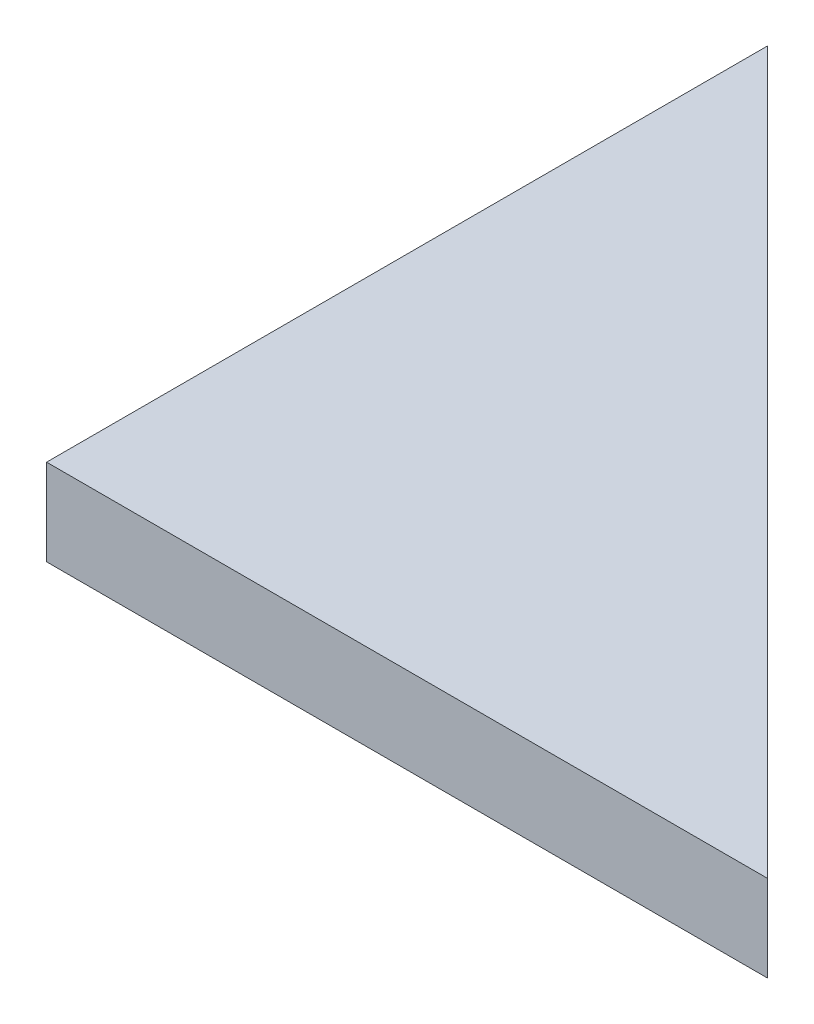
ISO-10303-21;
HEADER;
FILE_DESCRIPTION(('STEP AP214'),'2;1');
FILE_NAME('part.step','',(''),(''),'','','');
FILE_SCHEMA(('AUTOMOTIVE_DESIGN { 1 0 10303 214 1 1 1 1 }'));
ENDSEC;
DATA;
#1=APPLICATION_CONTEXT('core data for automotive mechanical design processes');
#2=APPLICATION_PROTOCOL_DEFINITION('international standard','automotive_design',2000,#1);
#3=PRODUCT_CONTEXT('',#1,'mechanical');
#4=PRODUCT('Part','Part','',(#3));
#5=PRODUCT_RELATED_PRODUCT_CATEGORY('part','',(#4));
#6=PRODUCT_DEFINITION_FORMATION('','',#4);
#7=PRODUCT_DEFINITION_CONTEXT('part definition',#1,'design');
#8=PRODUCT_DEFINITION('design','',#6,#7);
#9=PRODUCT_DEFINITION_SHAPE('','',#8);
#10=(LENGTH_UNIT() NAMED_UNIT(*) SI_UNIT(.MILLI.,.METRE.));
#11=(NAMED_UNIT(*) PLANE_ANGLE_UNIT() SI_UNIT($,.RADIAN.));
#12=(NAMED_UNIT(*) SI_UNIT($,.STERADIAN.) SOLID_ANGLE_UNIT());
#13=UNCERTAINTY_MEASURE_WITH_UNIT(LENGTH_MEASURE(1.E-05),#10,'distance_accuracy_value','');
#14=(GEOMETRIC_REPRESENTATION_CONTEXT(3) GLOBAL_UNCERTAINTY_ASSIGNED_CONTEXT((#13)) GLOBAL_UNIT_ASSIGNED_CONTEXT((#10,
#11,#12)) REPRESENTATION_CONTEXT('',''));
#15=CARTESIAN_POINT('',(0.,0.,0.));
#16=DIRECTION('',(0.,0.,1.));
#17=DIRECTION('',(1.,0.,0.));
#18=AXIS2_PLACEMENT_3D('',#15,#16,#17);
#19=CARTESIAN_POINT('',(0.,18.25625,0.));
#20=DIRECTION('',(0.,0.,-1.));
#21=DIRECTION('',(-1.,0.,0.));
#22=AXIS2_PLACEMENT_3D('',#19,#20,#21);
#23=PLANE('',#22);
#24=DIRECTION('',(1.,0.,0.));
#25=VECTOR('',#24,1.);
#26=CARTESIAN_POINT('',(0.,0.,0.));
#27=LINE('',#26,#25);
#28=CARTESIAN_POINT('',(0.,0.,0.));
#29=VERTEX_POINT('',#28);
#30=CARTESIAN_POINT('',(152.4,0.,0.));
#31=VERTEX_POINT('',#30);
#32=EDGE_CURVE('E81',#29,#31,#27,.T.);
#33=ORIENTED_EDGE('',*,*,#32,.T.);
#34=DIRECTION('',(0.,-1.,0.));
#35=VECTOR('',#34,1.);
#36=CARTESIAN_POINT('',(152.4,18.25625,0.));
#37=LINE('',#36,#35);
#38=CARTESIAN_POINT('',(152.4,18.25625,0.));
#39=VERTEX_POINT('',#38);
#40=EDGE_CURVE('E11',#39,#31,#37,.T.);
#41=ORIENTED_EDGE('',*,*,#40,.F.);
#42=DIRECTION('',(1.,0.,0.));
#43=VECTOR('',#42,1.);
#44=CARTESIAN_POINT('',(0.,18.25625,0.));
#45=LINE('',#44,#43);
#46=CARTESIAN_POINT('',(0.,18.25625,0.));
#47=VERTEX_POINT('',#46);
#48=EDGE_CURVE('E74',#47,#39,#45,.T.);
#49=ORIENTED_EDGE('',*,*,#48,.F.);
#50=DIRECTION('',(0.,-1.,0.));
#51=VECTOR('',#50,1.);
#52=CARTESIAN_POINT('',(0.,18.25625,0.));
#53=LINE('',#52,#51);
#54=EDGE_CURVE('E82',#47,#29,#53,.T.);
#55=ORIENTED_EDGE('',*,*,#54,.T.);
#56=EDGE_LOOP('',(#33,#41,#49,#55));
#57=FACE_BOUND('',#56,.T.);
#58=ADVANCED_FACE('F34',(#57),#23,.F.);
#59=CARTESIAN_POINT('',(0.,18.25625,-152.4));
#60=DIRECTION('',(-0.707106781186548,0.,0.707106781186548));
#61=DIRECTION('',(0.707106781186548,0.,0.707106781186548));
#62=AXIS2_PLACEMENT_3D('',#59,#60,#61);
#63=PLANE('',#62);
#64=DIRECTION('',(-0.707106781186547,0.,-0.707106781186547));
#65=VECTOR('',#64,1.);
#66=CARTESIAN_POINT('',(0.,0.,-152.4));
#67=LINE('',#66,#65);
#68=CARTESIAN_POINT('',(0.,0.,-152.4));
#69=VERTEX_POINT('',#68);
#70=EDGE_CURVE('E62',#31,#69,#67,.T.);
#71=ORIENTED_EDGE('',*,*,#70,.T.);
#72=DIRECTION('',(0.,-1.,0.));
#73=VECTOR('',#72,1.);
#74=CARTESIAN_POINT('',(0.,18.25625,-152.4));
#75=LINE('',#74,#73);
#76=CARTESIAN_POINT('',(0.,18.25625,-152.4));
#77=VERTEX_POINT('',#76);
#78=EDGE_CURVE('E42',#77,#69,#75,.T.);
#79=ORIENTED_EDGE('',*,*,#78,.F.);
#80=DIRECTION('',(-0.707106781186547,0.,-0.707106781186547));
#81=VECTOR('',#80,1.);
#82=CARTESIAN_POINT('',(0.,18.25625,-152.4));
#83=LINE('',#82,#81);
#84=EDGE_CURVE('E70',#39,#77,#83,.T.);
#85=ORIENTED_EDGE('',*,*,#84,.F.);
#86=ORIENTED_EDGE('',*,*,#40,.T.);
#87=EDGE_LOOP('',(#71,#79,#85,#86));
#88=FACE_BOUND('',#87,.T.);
#89=ADVANCED_FACE('F71',(#88),#63,.F.);
#90=CARTESIAN_POINT('',(0.,18.25625,0.));
#91=DIRECTION('',(1.,0.,0.));
#92=DIRECTION('',(0.,0.,-1.));
#93=AXIS2_PLACEMENT_3D('',#90,#91,#92);
#94=PLANE('',#93);
#95=DIRECTION('',(0.,0.,1.));
#96=VECTOR('',#95,1.);
#97=CARTESIAN_POINT('',(0.,0.,0.));
#98=LINE('',#97,#96);
#99=EDGE_CURVE('E67',#69,#29,#98,.T.);
#100=ORIENTED_EDGE('',*,*,#99,.T.);
#101=ORIENTED_EDGE('',*,*,#54,.F.);
#102=DIRECTION('',(0.,0.,1.));
#103=VECTOR('',#102,1.);
#104=CARTESIAN_POINT('',(0.,18.25625,0.));
#105=LINE('',#104,#103);
#106=EDGE_CURVE('E50',#77,#47,#105,.T.);
#107=ORIENTED_EDGE('',*,*,#106,.F.);
#108=ORIENTED_EDGE('',*,*,#78,.T.);
#109=EDGE_LOOP('',(#100,#101,#107,#108));
#110=FACE_BOUND('',#109,.T.);
#111=ADVANCED_FACE('F89',(#110),#94,.F.);
#112=CARTESIAN_POINT('',(0.,18.25625,0.));
#113=DIRECTION('',(0.,1.,0.));
#114=DIRECTION('',(0.,0.,1.));
#115=AXIS2_PLACEMENT_3D('',#112,#113,#114);
#116=PLANE('',#115);
#117=ORIENTED_EDGE('',*,*,#48,.T.);
#118=ORIENTED_EDGE('',*,*,#84,.T.);
#119=ORIENTED_EDGE('',*,*,#106,.T.);
#120=EDGE_LOOP('',(#117,#118,#119));
#121=FACE_BOUND('',#120,.T.);
#122=ADVANCED_FACE('F77',(#121),#116,.T.);
#123=CARTESIAN_POINT('',(0.,0.,0.));
#124=DIRECTION('',(0.,1.,0.));
#125=DIRECTION('',(0.,0.,1.));
#126=AXIS2_PLACEMENT_3D('',#123,#124,#125);
#127=PLANE('',#126);
#128=ORIENTED_EDGE('',*,*,#32,.F.);
#129=ORIENTED_EDGE('',*,*,#99,.F.);
#130=ORIENTED_EDGE('',*,*,#70,.F.);
#131=EDGE_LOOP('',(#128,#129,#130));
#132=FACE_BOUND('',#131,.T.);
#133=ADVANCED_FACE('F90',(#132),#127,.F.);
#134=CLOSED_SHELL('',(#58,#89,#111,#122,#133));
#135=MANIFOLD_SOLID_BREP('B2',#134);
#136=ADVANCED_BREP_SHAPE_REPRESENTATION('',(#18,#135),#14);
#137=SHAPE_DEFINITION_REPRESENTATION(#9,#136);
ENDSEC;
END-ISO-10303-21;
